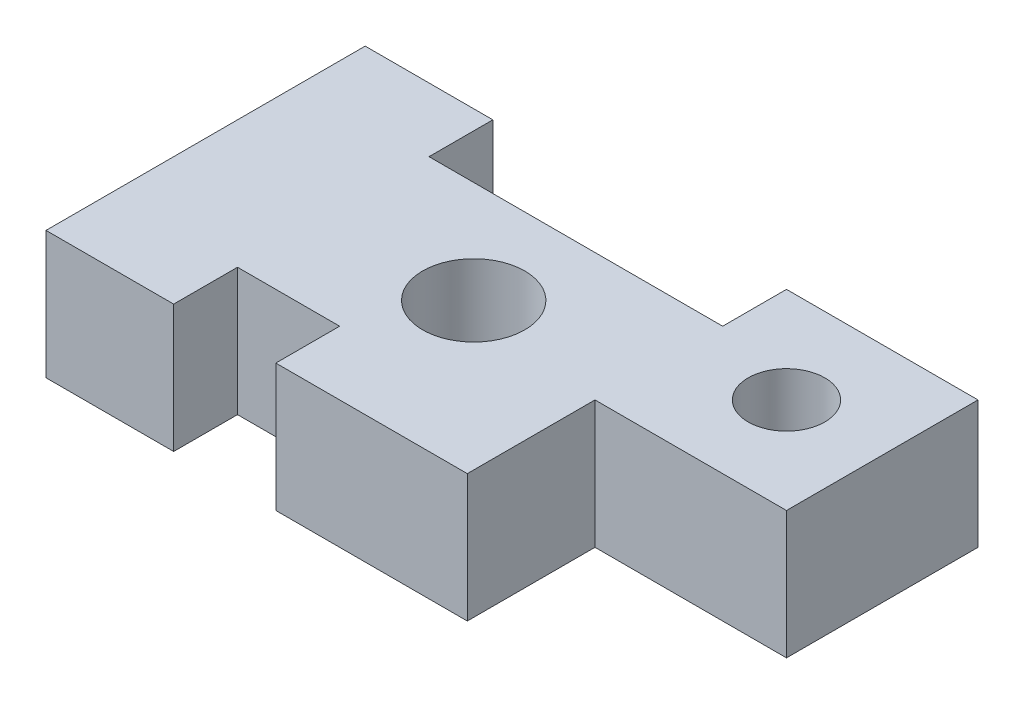
ISO-10303-21;
HEADER;
FILE_DESCRIPTION(('STEP AP214'),'2;1');
FILE_NAME('part.step','',(''),(''),'','','');
FILE_SCHEMA(('AUTOMOTIVE_DESIGN { 1 0 10303 214 1 1 1 1 }'));
ENDSEC;
DATA;
#1=APPLICATION_CONTEXT('core data for automotive mechanical design processes');
#2=APPLICATION_PROTOCOL_DEFINITION('international standard','automotive_design',2000,#1);
#3=PRODUCT_CONTEXT('',#1,'mechanical');
#4=PRODUCT('Part','Part','',(#3));
#5=PRODUCT_RELATED_PRODUCT_CATEGORY('part','',(#4));
#6=PRODUCT_DEFINITION_FORMATION('','',#4);
#7=PRODUCT_DEFINITION_CONTEXT('part definition',#1,'design');
#8=PRODUCT_DEFINITION('design','',#6,#7);
#9=PRODUCT_DEFINITION_SHAPE('','',#8);
#10=(LENGTH_UNIT() NAMED_UNIT(*) SI_UNIT(.MILLI.,.METRE.));
#11=(NAMED_UNIT(*) PLANE_ANGLE_UNIT() SI_UNIT($,.RADIAN.));
#12=(NAMED_UNIT(*) SI_UNIT($,.STERADIAN.) SOLID_ANGLE_UNIT());
#13=UNCERTAINTY_MEASURE_WITH_UNIT(LENGTH_MEASURE(1.E-05),#10,'distance_accuracy_value','');
#14=(GEOMETRIC_REPRESENTATION_CONTEXT(3) GLOBAL_UNCERTAINTY_ASSIGNED_CONTEXT((#13)) GLOBAL_UNIT_ASSIGNED_CONTEXT((#10,
#11,#12)) REPRESENTATION_CONTEXT('',''));
#15=CARTESIAN_POINT('',(0.,0.,0.));
#16=DIRECTION('',(0.,0.,1.));
#17=DIRECTION('',(1.,0.,0.));
#18=AXIS2_PLACEMENT_3D('',#15,#16,#17);
#19=CARTESIAN_POINT('',(0.,100.,0.));
#20=DIRECTION('',(0.,1.,0.));
#21=DIRECTION('',(0.,0.,1.));
#22=AXIS2_PLACEMENT_3D('',#19,#20,#21);
#23=PLANE('',#22);
#24=CARTESIAN_POINT('',(215.,100.,-120.));
#25=DIRECTION('',(0.,1.,0.));
#26=DIRECTION('',(0.,0.,1.));
#27=AXIS2_PLACEMENT_3D('',#24,#25,#26);
#28=CIRCLE('',#27,39.9999999999999);
#29=CARTESIAN_POINT('',(215.,100.,-160.));
#30=VERTEX_POINT('',#29);
#31=EDGE_CURVE('E170',#30,#30,#28,.T.);
#32=ORIENTED_EDGE('',*,*,#31,.F.);
#33=EDGE_LOOP('',(#32));
#34=FACE_BOUND('',#33,.T.);
#35=DIRECTION('',(0.,0.,1.));
#36=VECTOR('',#35,1.);
#37=CARTESIAN_POINT('',(0.,100.,0.));
#38=LINE('',#37,#36);
#39=CARTESIAN_POINT('',(0.,100.,-250.));
#40=VERTEX_POINT('',#39);
#41=CARTESIAN_POINT('',(0.,100.,0.));
#42=VERTEX_POINT('',#41);
#43=EDGE_CURVE('E193',#40,#42,#38,.T.);
#44=ORIENTED_EDGE('',*,*,#43,.T.);
#45=DIRECTION('',(1.,0.,0.));
#46=VECTOR('',#45,1.);
#47=CARTESIAN_POINT('',(0.,100.,0.));
#48=LINE('',#47,#46);
#49=CARTESIAN_POINT('',(100.,100.,0.));
#50=VERTEX_POINT('',#49);
#51=EDGE_CURVE('E111',#42,#50,#48,.T.);
#52=ORIENTED_EDGE('',*,*,#51,.T.);
#53=DIRECTION('',(0.,0.,-1.));
#54=VECTOR('',#53,1.);
#55=CARTESIAN_POINT('',(100.,100.,0.));
#56=LINE('',#55,#54);
#57=CARTESIAN_POINT('',(100.,100.,-50.));
#58=VERTEX_POINT('',#57);
#59=EDGE_CURVE('E226',#50,#58,#56,.T.);
#60=ORIENTED_EDGE('',*,*,#59,.T.);
#61=DIRECTION('',(1.,0.,0.));
#62=VECTOR('',#61,1.);
#63=CARTESIAN_POINT('',(100.,100.,-50.));
#64=LINE('',#63,#62);
#65=CARTESIAN_POINT('',(180.,100.,-50.));
#66=VERTEX_POINT('',#65);
#67=EDGE_CURVE('E245',#58,#66,#64,.T.);
#68=ORIENTED_EDGE('',*,*,#67,.T.);
#69=DIRECTION('',(0.,0.,1.));
#70=VECTOR('',#69,1.);
#71=CARTESIAN_POINT('',(180.,100.,-50.));
#72=LINE('',#71,#70);
#73=CARTESIAN_POINT('',(180.,100.,0.));
#74=VERTEX_POINT('',#73);
#75=EDGE_CURVE('E242',#66,#74,#72,.T.);
#76=ORIENTED_EDGE('',*,*,#75,.T.);
#77=DIRECTION('',(1.,0.,0.));
#78=VECTOR('',#77,1.);
#79=CARTESIAN_POINT('',(180.,100.,0.));
#80=LINE('',#79,#78);
#81=CARTESIAN_POINT('',(330.,100.,0.));
#82=VERTEX_POINT('',#81);
#83=EDGE_CURVE('E244',#74,#82,#80,.T.);
#84=ORIENTED_EDGE('',*,*,#83,.T.);
#85=DIRECTION('',(0.,0.,-1.));
#86=VECTOR('',#85,1.);
#87=CARTESIAN_POINT('',(330.,100.,0.));
#88=LINE('',#87,#86);
#89=CARTESIAN_POINT('',(330.,100.,-100.));
#90=VERTEX_POINT('',#89);
#91=EDGE_CURVE('E247',#82,#90,#88,.T.);
#92=ORIENTED_EDGE('',*,*,#91,.T.);
#93=DIRECTION('',(1.,0.,0.));
#94=VECTOR('',#93,1.);
#95=CARTESIAN_POINT('',(330.,100.,-100.));
#96=LINE('',#95,#94);
#97=CARTESIAN_POINT('',(480.,100.,-100.));
#98=VERTEX_POINT('',#97);
#99=EDGE_CURVE('E253',#90,#98,#96,.T.);
#100=ORIENTED_EDGE('',*,*,#99,.T.);
#101=DIRECTION('',(0.,0.,-1.));
#102=VECTOR('',#101,1.);
#103=CARTESIAN_POINT('',(480.,100.,-100.));
#104=LINE('',#103,#102);
#105=CARTESIAN_POINT('',(480.,100.,-250.));
#106=VERTEX_POINT('',#105);
#107=EDGE_CURVE('E255',#98,#106,#104,.T.);
#108=ORIENTED_EDGE('',*,*,#107,.T.);
#109=DIRECTION('',(-1.,0.,0.));
#110=VECTOR('',#109,1.);
#111=CARTESIAN_POINT('',(480.,100.,-250.));
#112=LINE('',#111,#110);
#113=CARTESIAN_POINT('',(330.,100.,-250.));
#114=VERTEX_POINT('',#113);
#115=EDGE_CURVE('E257',#106,#114,#112,.T.);
#116=ORIENTED_EDGE('',*,*,#115,.T.);
#117=DIRECTION('',(0.,0.,1.));
#118=VECTOR('',#117,1.);
#119=CARTESIAN_POINT('',(330.,100.,-250.));
#120=LINE('',#119,#118);
#121=CARTESIAN_POINT('',(330.,100.,-200.));
#122=VERTEX_POINT('',#121);
#123=EDGE_CURVE('E148',#114,#122,#120,.T.);
#124=ORIENTED_EDGE('',*,*,#123,.T.);
#125=DIRECTION('',(-1.,0.,0.));
#126=VECTOR('',#125,1.);
#127=CARTESIAN_POINT('',(330.,100.,-200.));
#128=LINE('',#127,#126);
#129=CARTESIAN_POINT('',(100.,100.,-200.));
#130=VERTEX_POINT('',#129);
#131=EDGE_CURVE('E142',#122,#130,#128,.T.);
#132=ORIENTED_EDGE('',*,*,#131,.T.);
#133=DIRECTION('',(0.,0.,-1.));
#134=VECTOR('',#133,1.);
#135=CARTESIAN_POINT('',(100.,100.,-200.));
#136=LINE('',#135,#134);
#137=CARTESIAN_POINT('',(100.,100.,-250.));
#138=VERTEX_POINT('',#137);
#139=EDGE_CURVE('E146',#130,#138,#136,.T.);
#140=ORIENTED_EDGE('',*,*,#139,.T.);
#141=DIRECTION('',(-1.,0.,0.));
#142=VECTOR('',#141,1.);
#143=CARTESIAN_POINT('',(100.,100.,-250.));
#144=LINE('',#143,#142);
#145=EDGE_CURVE('E50',#138,#40,#144,.T.);
#146=ORIENTED_EDGE('',*,*,#145,.T.);
#147=EDGE_LOOP('',(#44,#52,#60,#68,#76,#84,#92,#100,#108,#116,#124,#132,#140,#146));
#148=FACE_BOUND('',#147,.T.);
#149=CARTESIAN_POINT('',(405.,100.,-175.));
#150=DIRECTION('',(0.,1.,0.));
#151=DIRECTION('',(0.,0.,1.));
#152=AXIS2_PLACEMENT_3D('',#149,#150,#151);
#153=CIRCLE('',#152,30.);
#154=CARTESIAN_POINT('',(405.,100.,-205.));
#155=VERTEX_POINT('',#154);
#156=EDGE_CURVE('E300',#155,#155,#153,.T.);
#157=ORIENTED_EDGE('',*,*,#156,.F.);
#158=EDGE_LOOP('',(#157));
#159=FACE_BOUND('',#158,.T.);
#160=ADVANCED_FACE('F33',(#34,#148,#159),#23,.T.);
#161=CARTESIAN_POINT('',(0.,0.,0.));
#162=DIRECTION('',(0.,1.,0.));
#163=DIRECTION('',(0.,0.,1.));
#164=AXIS2_PLACEMENT_3D('',#161,#162,#163);
#165=PLANE('',#164);
#166=CARTESIAN_POINT('',(215.,0.,-120.));
#167=DIRECTION('',(0.,1.,0.));
#168=DIRECTION('',(0.,0.,1.));
#169=AXIS2_PLACEMENT_3D('',#166,#167,#168);
#170=CIRCLE('',#169,39.9999999999999);
#171=CARTESIAN_POINT('',(215.,0.,-160.));
#172=VERTEX_POINT('',#171);
#173=EDGE_CURVE('E305',#172,#172,#170,.T.);
#174=ORIENTED_EDGE('',*,*,#173,.T.);
#175=EDGE_LOOP('',(#174));
#176=FACE_BOUND('',#175,.T.);
#177=DIRECTION('',(0.,0.,1.));
#178=VECTOR('',#177,1.);
#179=CARTESIAN_POINT('',(0.,0.,0.));
#180=LINE('',#179,#178);
#181=CARTESIAN_POINT('',(0.,0.,-250.));
#182=VERTEX_POINT('',#181);
#183=CARTESIAN_POINT('',(0.,0.,0.));
#184=VERTEX_POINT('',#183);
#185=EDGE_CURVE('E166',#182,#184,#180,.T.);
#186=ORIENTED_EDGE('',*,*,#185,.F.);
#187=DIRECTION('',(-1.,0.,0.));
#188=VECTOR('',#187,1.);
#189=CARTESIAN_POINT('',(100.,0.,-250.));
#190=LINE('',#189,#188);
#191=CARTESIAN_POINT('',(100.,0.,-250.));
#192=VERTEX_POINT('',#191);
#193=EDGE_CURVE('E103',#192,#182,#190,.T.);
#194=ORIENTED_EDGE('',*,*,#193,.F.);
#195=DIRECTION('',(0.,0.,-1.));
#196=VECTOR('',#195,1.);
#197=CARTESIAN_POINT('',(100.,0.,-200.));
#198=LINE('',#197,#196);
#199=CARTESIAN_POINT('',(100.,0.,-200.));
#200=VERTEX_POINT('',#199);
#201=EDGE_CURVE('E97',#200,#192,#198,.T.);
#202=ORIENTED_EDGE('',*,*,#201,.F.);
#203=DIRECTION('',(-1.,0.,0.));
#204=VECTOR('',#203,1.);
#205=CARTESIAN_POINT('',(330.,0.,-200.));
#206=LINE('',#205,#204);
#207=CARTESIAN_POINT('',(330.,0.,-200.));
#208=VERTEX_POINT('',#207);
#209=EDGE_CURVE('E156',#208,#200,#206,.T.);
#210=ORIENTED_EDGE('',*,*,#209,.F.);
#211=DIRECTION('',(0.,0.,1.));
#212=VECTOR('',#211,1.);
#213=CARTESIAN_POINT('',(330.,0.,-250.));
#214=LINE('',#213,#212);
#215=CARTESIAN_POINT('',(330.,0.,-250.));
#216=VERTEX_POINT('',#215);
#217=EDGE_CURVE('E188',#216,#208,#214,.T.);
#218=ORIENTED_EDGE('',*,*,#217,.F.);
#219=DIRECTION('',(-1.,0.,0.));
#220=VECTOR('',#219,1.);
#221=CARTESIAN_POINT('',(480.,0.,-250.));
#222=LINE('',#221,#220);
#223=CARTESIAN_POINT('',(480.,0.,-250.));
#224=VERTEX_POINT('',#223);
#225=EDGE_CURVE('E186',#224,#216,#222,.T.);
#226=ORIENTED_EDGE('',*,*,#225,.F.);
#227=DIRECTION('',(0.,0.,-1.));
#228=VECTOR('',#227,1.);
#229=CARTESIAN_POINT('',(480.,0.,-100.));
#230=LINE('',#229,#228);
#231=CARTESIAN_POINT('',(480.,0.,-100.));
#232=VERTEX_POINT('',#231);
#233=EDGE_CURVE('E184',#232,#224,#230,.T.);
#234=ORIENTED_EDGE('',*,*,#233,.F.);
#235=DIRECTION('',(1.,0.,0.));
#236=VECTOR('',#235,1.);
#237=CARTESIAN_POINT('',(330.,0.,-100.));
#238=LINE('',#237,#236);
#239=CARTESIAN_POINT('',(330.,0.,-100.));
#240=VERTEX_POINT('',#239);
#241=EDGE_CURVE('E182',#240,#232,#238,.T.);
#242=ORIENTED_EDGE('',*,*,#241,.F.);
#243=DIRECTION('',(0.,0.,-1.));
#244=VECTOR('',#243,1.);
#245=CARTESIAN_POINT('',(330.,0.,0.));
#246=LINE('',#245,#244);
#247=CARTESIAN_POINT('',(330.,0.,0.));
#248=VERTEX_POINT('',#247);
#249=EDGE_CURVE('E180',#248,#240,#246,.T.);
#250=ORIENTED_EDGE('',*,*,#249,.F.);
#251=DIRECTION('',(1.,0.,0.));
#252=VECTOR('',#251,1.);
#253=CARTESIAN_POINT('',(180.,0.,0.));
#254=LINE('',#253,#252);
#255=CARTESIAN_POINT('',(180.,0.,0.));
#256=VERTEX_POINT('',#255);
#257=EDGE_CURVE('E178',#256,#248,#254,.T.);
#258=ORIENTED_EDGE('',*,*,#257,.F.);
#259=DIRECTION('',(0.,0.,1.));
#260=VECTOR('',#259,1.);
#261=CARTESIAN_POINT('',(180.,0.,-50.));
#262=LINE('',#261,#260);
#263=CARTESIAN_POINT('',(180.,0.,-50.));
#264=VERTEX_POINT('',#263);
#265=EDGE_CURVE('E176',#264,#256,#262,.T.);
#266=ORIENTED_EDGE('',*,*,#265,.F.);
#267=DIRECTION('',(1.,0.,0.));
#268=VECTOR('',#267,1.);
#269=CARTESIAN_POINT('',(100.,0.,-50.));
#270=LINE('',#269,#268);
#271=CARTESIAN_POINT('',(100.,0.,-50.));
#272=VERTEX_POINT('',#271);
#273=EDGE_CURVE('E174',#272,#264,#270,.T.);
#274=ORIENTED_EDGE('',*,*,#273,.F.);
#275=DIRECTION('',(0.,0.,-1.));
#276=VECTOR('',#275,1.);
#277=CARTESIAN_POINT('',(100.,0.,0.));
#278=LINE('',#277,#276);
#279=CARTESIAN_POINT('',(100.,0.,0.));
#280=VERTEX_POINT('',#279);
#281=EDGE_CURVE('E172',#280,#272,#278,.T.);
#282=ORIENTED_EDGE('',*,*,#281,.F.);
#283=DIRECTION('',(1.,0.,0.));
#284=VECTOR('',#283,1.);
#285=CARTESIAN_POINT('',(0.,0.,0.));
#286=LINE('',#285,#284);
#287=EDGE_CURVE('E169',#184,#280,#286,.T.);
#288=ORIENTED_EDGE('',*,*,#287,.F.);
#289=EDGE_LOOP('',(#186,#194,#202,#210,#218,#226,#234,#242,#250,#258,#266,#274,#282,#288));
#290=FACE_BOUND('',#289,.T.);
#291=CARTESIAN_POINT('',(405.,0.,-175.));
#292=DIRECTION('',(0.,1.,0.));
#293=DIRECTION('',(0.,0.,1.));
#294=AXIS2_PLACEMENT_3D('',#291,#292,#293);
#295=CIRCLE('',#294,30.);
#296=CARTESIAN_POINT('',(405.,0.,-205.));
#297=VERTEX_POINT('',#296);
#298=EDGE_CURVE('E303',#297,#297,#295,.T.);
#299=ORIENTED_EDGE('',*,*,#298,.T.);
#300=EDGE_LOOP('',(#299));
#301=FACE_BOUND('',#300,.T.);
#302=ADVANCED_FACE('F230',(#176,#290,#301),#165,.F.);
#303=CARTESIAN_POINT('',(0.,100.,0.));
#304=DIRECTION('',(1.,0.,0.));
#305=DIRECTION('',(0.,0.,-1.));
#306=AXIS2_PLACEMENT_3D('',#303,#304,#305);
#307=PLANE('',#306);
#308=ORIENTED_EDGE('',*,*,#185,.T.);
#309=DIRECTION('',(0.,-1.,0.));
#310=VECTOR('',#309,1.);
#311=CARTESIAN_POINT('',(0.,100.,0.));
#312=LINE('',#311,#310);
#313=EDGE_CURVE('E11',#42,#184,#312,.T.);
#314=ORIENTED_EDGE('',*,*,#313,.F.);
#315=ORIENTED_EDGE('',*,*,#43,.F.);
#316=DIRECTION('',(0.,-1.,0.));
#317=VECTOR('',#316,1.);
#318=CARTESIAN_POINT('',(0.,100.,-250.));
#319=LINE('',#318,#317);
#320=EDGE_CURVE('E162',#40,#182,#319,.T.);
#321=ORIENTED_EDGE('',*,*,#320,.T.);
#322=EDGE_LOOP('',(#308,#314,#315,#321));
#323=FACE_BOUND('',#322,.T.);
#324=ADVANCED_FACE('F35',(#323),#307,.F.);
#325=CARTESIAN_POINT('',(0.,100.,0.));
#326=DIRECTION('',(0.,0.,-1.));
#327=DIRECTION('',(-1.,0.,0.));
#328=AXIS2_PLACEMENT_3D('',#325,#326,#327);
#329=PLANE('',#328);
#330=ORIENTED_EDGE('',*,*,#287,.T.);
#331=DIRECTION('',(0.,-1.,0.));
#332=VECTOR('',#331,1.);
#333=CARTESIAN_POINT('',(100.,100.,0.));
#334=LINE('',#333,#332);
#335=EDGE_CURVE('E42',#50,#280,#334,.T.);
#336=ORIENTED_EDGE('',*,*,#335,.F.);
#337=ORIENTED_EDGE('',*,*,#51,.F.);
#338=ORIENTED_EDGE('',*,*,#313,.T.);
#339=EDGE_LOOP('',(#330,#336,#337,#338));
#340=FACE_BOUND('',#339,.T.);
#341=ADVANCED_FACE('F418',(#340),#329,.F.);
#342=CARTESIAN_POINT('',(100.,100.,0.));
#343=DIRECTION('',(-1.,0.,0.));
#344=DIRECTION('',(0.,0.,1.));
#345=AXIS2_PLACEMENT_3D('',#342,#343,#344);
#346=PLANE('',#345);
#347=ORIENTED_EDGE('',*,*,#281,.T.);
#348=DIRECTION('',(0.,-1.,0.));
#349=VECTOR('',#348,1.);
#350=CARTESIAN_POINT('',(100.,100.,-50.));
#351=LINE('',#350,#349);
#352=EDGE_CURVE('E218',#58,#272,#351,.T.);
#353=ORIENTED_EDGE('',*,*,#352,.F.);
#354=ORIENTED_EDGE('',*,*,#59,.F.);
#355=ORIENTED_EDGE('',*,*,#335,.T.);
#356=EDGE_LOOP('',(#347,#353,#354,#355));
#357=FACE_BOUND('',#356,.T.);
#358=ADVANCED_FACE('F224',(#357),#346,.F.);
#359=CARTESIAN_POINT('',(100.,100.,-50.));
#360=DIRECTION('',(0.,0.,-1.));
#361=DIRECTION('',(-1.,0.,0.));
#362=AXIS2_PLACEMENT_3D('',#359,#360,#361);
#363=PLANE('',#362);
#364=ORIENTED_EDGE('',*,*,#273,.T.);
#365=DIRECTION('',(0.,-1.,0.));
#366=VECTOR('',#365,1.);
#367=CARTESIAN_POINT('',(180.,100.,-50.));
#368=LINE('',#367,#366);
#369=EDGE_CURVE('E215',#66,#264,#368,.T.);
#370=ORIENTED_EDGE('',*,*,#369,.F.);
#371=ORIENTED_EDGE('',*,*,#67,.F.);
#372=ORIENTED_EDGE('',*,*,#352,.T.);
#373=EDGE_LOOP('',(#364,#370,#371,#372));
#374=FACE_BOUND('',#373,.T.);
#375=ADVANCED_FACE('F236',(#374),#363,.F.);
#376=CARTESIAN_POINT('',(180.,100.,-50.));
#377=DIRECTION('',(1.,0.,0.));
#378=DIRECTION('',(0.,0.,-1.));
#379=AXIS2_PLACEMENT_3D('',#376,#377,#378);
#380=PLANE('',#379);
#381=ORIENTED_EDGE('',*,*,#265,.T.);
#382=DIRECTION('',(0.,-1.,0.));
#383=VECTOR('',#382,1.);
#384=CARTESIAN_POINT('',(180.,100.,0.));
#385=LINE('',#384,#383);
#386=EDGE_CURVE('E212',#74,#256,#385,.T.);
#387=ORIENTED_EDGE('',*,*,#386,.F.);
#388=ORIENTED_EDGE('',*,*,#75,.F.);
#389=ORIENTED_EDGE('',*,*,#369,.T.);
#390=EDGE_LOOP('',(#381,#387,#388,#389));
#391=FACE_BOUND('',#390,.T.);
#392=ADVANCED_FACE('F240',(#391),#380,.F.);
#393=CARTESIAN_POINT('',(180.,100.,0.));
#394=DIRECTION('',(0.,0.,-1.));
#395=DIRECTION('',(-1.,0.,0.));
#396=AXIS2_PLACEMENT_3D('',#393,#394,#395);
#397=PLANE('',#396);
#398=ORIENTED_EDGE('',*,*,#257,.T.);
#399=DIRECTION('',(0.,-1.,0.));
#400=VECTOR('',#399,1.);
#401=CARTESIAN_POINT('',(330.,100.,0.));
#402=LINE('',#401,#400);
#403=EDGE_CURVE('E209',#82,#248,#402,.T.);
#404=ORIENTED_EDGE('',*,*,#403,.F.);
#405=ORIENTED_EDGE('',*,*,#83,.F.);
#406=ORIENTED_EDGE('',*,*,#386,.T.);
#407=EDGE_LOOP('',(#398,#404,#405,#406));
#408=FACE_BOUND('',#407,.T.);
#409=ADVANCED_FACE('F383',(#408),#397,.F.);
#410=CARTESIAN_POINT('',(330.,100.,0.));
#411=DIRECTION('',(-1.,0.,0.));
#412=DIRECTION('',(0.,0.,1.));
#413=AXIS2_PLACEMENT_3D('',#410,#411,#412);
#414=PLANE('',#413);
#415=ORIENTED_EDGE('',*,*,#249,.T.);
#416=DIRECTION('',(0.,-1.,0.));
#417=VECTOR('',#416,1.);
#418=CARTESIAN_POINT('',(330.,100.,-100.));
#419=LINE('',#418,#417);
#420=EDGE_CURVE('E206',#90,#240,#419,.T.);
#421=ORIENTED_EDGE('',*,*,#420,.F.);
#422=ORIENTED_EDGE('',*,*,#91,.F.);
#423=ORIENTED_EDGE('',*,*,#403,.T.);
#424=EDGE_LOOP('',(#415,#421,#422,#423));
#425=FACE_BOUND('',#424,.T.);
#426=ADVANCED_FACE('F373',(#425),#414,.F.);
#427=CARTESIAN_POINT('',(330.,100.,-100.));
#428=DIRECTION('',(0.,0.,-1.));
#429=DIRECTION('',(-1.,0.,0.));
#430=AXIS2_PLACEMENT_3D('',#427,#428,#429);
#431=PLANE('',#430);
#432=ORIENTED_EDGE('',*,*,#241,.T.);
#433=DIRECTION('',(0.,-1.,0.));
#434=VECTOR('',#433,1.);
#435=CARTESIAN_POINT('',(480.,100.,-100.));
#436=LINE('',#435,#434);
#437=EDGE_CURVE('E203',#98,#232,#436,.T.);
#438=ORIENTED_EDGE('',*,*,#437,.F.);
#439=ORIENTED_EDGE('',*,*,#99,.F.);
#440=ORIENTED_EDGE('',*,*,#420,.T.);
#441=EDGE_LOOP('',(#432,#438,#439,#440));
#442=FACE_BOUND('',#441,.T.);
#443=ADVANCED_FACE('F363',(#442),#431,.F.);
#444=CARTESIAN_POINT('',(480.,100.,-100.));
#445=DIRECTION('',(-1.,0.,0.));
#446=DIRECTION('',(0.,0.,1.));
#447=AXIS2_PLACEMENT_3D('',#444,#445,#446);
#448=PLANE('',#447);
#449=ORIENTED_EDGE('',*,*,#233,.T.);
#450=DIRECTION('',(0.,-1.,0.));
#451=VECTOR('',#450,1.);
#452=CARTESIAN_POINT('',(480.,100.,-250.));
#453=LINE('',#452,#451);
#454=EDGE_CURVE('E200',#106,#224,#453,.T.);
#455=ORIENTED_EDGE('',*,*,#454,.F.);
#456=ORIENTED_EDGE('',*,*,#107,.F.);
#457=ORIENTED_EDGE('',*,*,#437,.T.);
#458=EDGE_LOOP('',(#449,#455,#456,#457));
#459=FACE_BOUND('',#458,.T.);
#460=ADVANCED_FACE('F354',(#459),#448,.F.);
#461=CARTESIAN_POINT('',(480.,100.,-250.));
#462=DIRECTION('',(0.,0.,1.));
#463=DIRECTION('',(1.,0.,0.));
#464=AXIS2_PLACEMENT_3D('',#461,#462,#463);
#465=PLANE('',#464);
#466=ORIENTED_EDGE('',*,*,#225,.T.);
#467=DIRECTION('',(0.,-1.,0.));
#468=VECTOR('',#467,1.);
#469=CARTESIAN_POINT('',(330.,100.,-250.));
#470=LINE('',#469,#468);
#471=EDGE_CURVE('E197',#114,#216,#470,.T.);
#472=ORIENTED_EDGE('',*,*,#471,.F.);
#473=ORIENTED_EDGE('',*,*,#115,.F.);
#474=ORIENTED_EDGE('',*,*,#454,.T.);
#475=EDGE_LOOP('',(#466,#472,#473,#474));
#476=FACE_BOUND('',#475,.T.);
#477=ADVANCED_FACE('F263',(#476),#465,.F.);
#478=CARTESIAN_POINT('',(330.,100.,-250.));
#479=DIRECTION('',(1.,0.,0.));
#480=DIRECTION('',(0.,0.,-1.));
#481=AXIS2_PLACEMENT_3D('',#478,#479,#480);
#482=PLANE('',#481);
#483=ORIENTED_EDGE('',*,*,#217,.T.);
#484=DIRECTION('',(0.,-1.,0.));
#485=VECTOR('',#484,1.);
#486=CARTESIAN_POINT('',(330.,100.,-200.));
#487=LINE('',#486,#485);
#488=EDGE_CURVE('E157',#122,#208,#487,.T.);
#489=ORIENTED_EDGE('',*,*,#488,.F.);
#490=ORIENTED_EDGE('',*,*,#123,.F.);
#491=ORIENTED_EDGE('',*,*,#471,.T.);
#492=EDGE_LOOP('',(#483,#489,#490,#491));
#493=FACE_BOUND('',#492,.T.);
#494=ADVANCED_FACE('F267',(#493),#482,.F.);
#495=CARTESIAN_POINT('',(330.,100.,-200.));
#496=DIRECTION('',(0.,0.,1.));
#497=DIRECTION('',(1.,0.,0.));
#498=AXIS2_PLACEMENT_3D('',#495,#496,#497);
#499=PLANE('',#498);
#500=ORIENTED_EDGE('',*,*,#209,.T.);
#501=DIRECTION('',(0.,-1.,0.));
#502=VECTOR('',#501,1.);
#503=CARTESIAN_POINT('',(100.,100.,-200.));
#504=LINE('',#503,#502);
#505=EDGE_CURVE('E153',#130,#200,#504,.T.);
#506=ORIENTED_EDGE('',*,*,#505,.F.);
#507=ORIENTED_EDGE('',*,*,#131,.F.);
#508=ORIENTED_EDGE('',*,*,#488,.T.);
#509=EDGE_LOOP('',(#500,#506,#507,#508));
#510=FACE_BOUND('',#509,.T.);
#511=ADVANCED_FACE('F154',(#510),#499,.F.);
#512=CARTESIAN_POINT('',(100.,100.,-200.));
#513=DIRECTION('',(-1.,0.,0.));
#514=DIRECTION('',(0.,0.,1.));
#515=AXIS2_PLACEMENT_3D('',#512,#513,#514);
#516=PLANE('',#515);
#517=ORIENTED_EDGE('',*,*,#201,.T.);
#518=DIRECTION('',(0.,-1.,0.));
#519=VECTOR('',#518,1.);
#520=CARTESIAN_POINT('',(100.,100.,-250.));
#521=LINE('',#520,#519);
#522=EDGE_CURVE('E158',#138,#192,#521,.T.);
#523=ORIENTED_EDGE('',*,*,#522,.F.);
#524=ORIENTED_EDGE('',*,*,#139,.F.);
#525=ORIENTED_EDGE('',*,*,#505,.T.);
#526=EDGE_LOOP('',(#517,#523,#524,#525));
#527=FACE_BOUND('',#526,.T.);
#528=ADVANCED_FACE('F160',(#527),#516,.F.);
#529=CARTESIAN_POINT('',(100.,100.,-250.));
#530=DIRECTION('',(0.,0.,1.));
#531=DIRECTION('',(1.,0.,0.));
#532=AXIS2_PLACEMENT_3D('',#529,#530,#531);
#533=PLANE('',#532);
#534=ORIENTED_EDGE('',*,*,#193,.T.);
#535=ORIENTED_EDGE('',*,*,#320,.F.);
#536=ORIENTED_EDGE('',*,*,#145,.F.);
#537=ORIENTED_EDGE('',*,*,#522,.T.);
#538=EDGE_LOOP('',(#534,#535,#536,#537));
#539=FACE_BOUND('',#538,.T.);
#540=ADVANCED_FACE('F271',(#539),#533,.F.);
#541=CARTESIAN_POINT('',(215.,100.,-120.));
#542=DIRECTION('',(0.,-1.,0.));
#543=DIRECTION('',(0.,0.,-1.));
#544=AXIS2_PLACEMENT_3D('',#541,#542,#543);
#545=CYLINDRICAL_SURFACE('',#544,39.9999999999999);
#546=CARTESIAN_POINT('',(215.,100.,-160.));
#547=CARTESIAN_POINT('',(215.,98.9583333333333,-160.));
#548=CARTESIAN_POINT('',(215.,97.9166666666667,-160.));
#549=CARTESIAN_POINT('',(215.,95.8333333333333,-160.));
#550=CARTESIAN_POINT('',(215.,94.7916666666666,-160.));
#551=CARTESIAN_POINT('',(215.,92.7083333333333,-160.));
#552=CARTESIAN_POINT('',(215.,91.6666666666666,-160.));
#553=CARTESIAN_POINT('',(215.,89.5833333333333,-160.));
#554=CARTESIAN_POINT('',(215.,88.5416666666667,-160.));
#555=CARTESIAN_POINT('',(215.,86.4583333333333,-160.));
#556=CARTESIAN_POINT('',(215.,85.4166666666667,-160.));
#557=CARTESIAN_POINT('',(215.,83.3333333333333,-160.));
#558=CARTESIAN_POINT('',(215.,82.2916666666667,-160.));
#559=CARTESIAN_POINT('',(215.,80.2083333333333,-160.));
#560=CARTESIAN_POINT('',(215.,79.1666666666666,-160.));
#561=CARTESIAN_POINT('',(215.,77.0833333333333,-160.));
#562=CARTESIAN_POINT('',(215.,76.0416666666666,-160.));
#563=CARTESIAN_POINT('',(215.,73.9583333333333,-160.));
#564=CARTESIAN_POINT('',(215.,72.9166666666667,-160.));
#565=CARTESIAN_POINT('',(215.,70.8333333333333,-160.));
#566=CARTESIAN_POINT('',(215.,69.7916666666667,-160.));
#567=CARTESIAN_POINT('',(215.,67.7083333333333,-160.));
#568=CARTESIAN_POINT('',(215.,66.6666666666667,-160.));
#569=CARTESIAN_POINT('',(215.,64.5833333333333,-160.));
#570=CARTESIAN_POINT('',(215.,63.5416666666667,-160.));
#571=CARTESIAN_POINT('',(215.,61.4583333333333,-160.));
#572=CARTESIAN_POINT('',(215.,60.4166666666667,-160.));
#573=CARTESIAN_POINT('',(215.,58.3333333333333,-160.));
#574=CARTESIAN_POINT('',(215.,57.2916666666667,-160.));
#575=CARTESIAN_POINT('',(215.,55.2083333333333,-160.));
#576=CARTESIAN_POINT('',(215.,54.1666666666667,-160.));
#577=CARTESIAN_POINT('',(215.,52.0833333333333,-160.));
#578=CARTESIAN_POINT('',(215.,51.0416666666667,-160.));
#579=CARTESIAN_POINT('',(215.,48.9583333333333,-160.));
#580=CARTESIAN_POINT('',(215.,47.9166666666667,-160.));
#581=CARTESIAN_POINT('',(215.,45.8333333333333,-160.));
#582=CARTESIAN_POINT('',(215.,44.7916666666667,-160.));
#583=CARTESIAN_POINT('',(215.,42.7083333333333,-160.));
#584=CARTESIAN_POINT('',(215.,41.6666666666667,-160.));
#585=CARTESIAN_POINT('',(215.,39.5833333333333,-160.));
#586=CARTESIAN_POINT('',(215.,38.5416666666667,-160.));
#587=CARTESIAN_POINT('',(215.,36.4583333333333,-160.));
#588=CARTESIAN_POINT('',(215.,35.4166666666667,-160.));
#589=CARTESIAN_POINT('',(215.,33.3333333333333,-160.));
#590=CARTESIAN_POINT('',(215.,32.2916666666667,-160.));
#591=CARTESIAN_POINT('',(215.,30.2083333333333,-160.));
#592=CARTESIAN_POINT('',(215.,29.1666666666667,-160.));
#593=CARTESIAN_POINT('',(215.,27.0833333333333,-160.));
#594=CARTESIAN_POINT('',(215.,26.0416666666667,-160.));
#595=CARTESIAN_POINT('',(215.,23.9583333333333,-160.));
#596=CARTESIAN_POINT('',(215.,22.9166666666667,-160.));
#597=CARTESIAN_POINT('',(215.,20.8333333333333,-160.));
#598=CARTESIAN_POINT('',(215.,19.7916666666667,-160.));
#599=CARTESIAN_POINT('',(215.,17.7083333333333,-160.));
#600=CARTESIAN_POINT('',(215.,16.6666666666667,-160.));
#601=CARTESIAN_POINT('',(215.,14.5833333333333,-160.));
#602=CARTESIAN_POINT('',(215.,13.5416666666667,-160.));
#603=CARTESIAN_POINT('',(215.,11.4583333333333,-160.));
#604=CARTESIAN_POINT('',(215.,10.4166666666667,-160.));
#605=CARTESIAN_POINT('',(215.,8.33333333333333,-160.));
#606=CARTESIAN_POINT('',(215.,7.29166666666667,-160.));
#607=CARTESIAN_POINT('',(215.,5.20833333333334,-160.));
#608=CARTESIAN_POINT('',(215.,4.16666666666667,-160.));
#609=CARTESIAN_POINT('',(215.,2.08333333333334,-160.));
#610=CARTESIAN_POINT('',(215.,1.04166666666667,-160.));
#611=CARTESIAN_POINT('',(215.,0.,-160.));
#612=B_SPLINE_CURVE_WITH_KNOTS('',3,(#546,#547,#548,#549,#550,#551,#552,#553,#554,#555,#556,
#557,#558,#559,#560,#561,#562,#563,#564,#565,#566,#567,#568,#569,#570,#571,#572,#573,#574,#575,
#576,#577,#578,#579,#580,#581,#582,#583,#584,#585,#586,#587,#588,#589,#590,#591,#592,#593,#594,
#595,#596,#597,#598,#599,#600,#601,#602,#603,#604,#605,#606,#607,#608,#609,#610,#611),
.UNSPECIFIED.,.F.,.F.,(4,2,2,2,2,2,2,2,2,2,2,2,2,2,2,2,2,2,2,2,2,2,2,2,2,2,2,2,2,2,2,2,4),(0.,
3.12499999999999,6.24999999999999,9.37499999999999,12.5,15.625,18.75,21.875,25.,28.125,31.25,
34.375,37.5,40.625,43.75,46.875,50.,53.125,56.25,59.375,62.5,65.625,68.75,71.875,75.,78.125,
81.25,84.375,87.5,90.625,93.75,96.875,100.),.UNSPECIFIED.);
#613=EDGE_CURVE('BSEAM273',#30,#172,#612,.T.);
#614=ORIENTED_EDGE('',*,*,#31,.T.);
#615=ORIENTED_EDGE('',*,*,#173,.F.);
#616=ORIENTED_EDGE('',*,*,#613,.T.);
#617=ORIENTED_EDGE('',*,*,#613,.F.);
#618=EDGE_LOOP('',(#614,#616,#615,#617));
#619=FACE_BOUND('',#618,.T.);
#620=ADVANCED_FACE('F273',(#619),#545,.F.);
#621=CARTESIAN_POINT('',(405.,100.,-175.));
#622=DIRECTION('',(0.,-1.,0.));
#623=DIRECTION('',(0.,0.,-1.));
#624=AXIS2_PLACEMENT_3D('',#621,#622,#623);
#625=CYLINDRICAL_SURFACE('',#624,30.);
#626=CARTESIAN_POINT('',(405.,100.,-205.));
#627=CARTESIAN_POINT('',(405.,98.9583333333333,-205.));
#628=CARTESIAN_POINT('',(405.,97.9166666666667,-205.));
#629=CARTESIAN_POINT('',(405.,95.8333333333333,-205.));
#630=CARTESIAN_POINT('',(405.,94.7916666666666,-205.));
#631=CARTESIAN_POINT('',(405.,92.7083333333333,-205.));
#632=CARTESIAN_POINT('',(405.,91.6666666666666,-205.));
#633=CARTESIAN_POINT('',(405.,89.5833333333333,-205.));
#634=CARTESIAN_POINT('',(405.,88.5416666666667,-205.));
#635=CARTESIAN_POINT('',(405.,86.4583333333333,-205.));
#636=CARTESIAN_POINT('',(405.,85.4166666666667,-205.));
#637=CARTESIAN_POINT('',(405.,83.3333333333333,-205.));
#638=CARTESIAN_POINT('',(405.,82.2916666666667,-205.));
#639=CARTESIAN_POINT('',(405.,80.2083333333333,-205.));
#640=CARTESIAN_POINT('',(405.,79.1666666666666,-205.));
#641=CARTESIAN_POINT('',(405.,77.0833333333333,-205.));
#642=CARTESIAN_POINT('',(405.,76.0416666666666,-205.));
#643=CARTESIAN_POINT('',(405.,73.9583333333333,-205.));
#644=CARTESIAN_POINT('',(405.,72.9166666666667,-205.));
#645=CARTESIAN_POINT('',(405.,70.8333333333333,-205.));
#646=CARTESIAN_POINT('',(405.,69.7916666666667,-205.));
#647=CARTESIAN_POINT('',(405.,67.7083333333333,-205.));
#648=CARTESIAN_POINT('',(405.,66.6666666666667,-205.));
#649=CARTESIAN_POINT('',(405.,64.5833333333333,-205.));
#650=CARTESIAN_POINT('',(405.,63.5416666666667,-205.));
#651=CARTESIAN_POINT('',(405.,61.4583333333333,-205.));
#652=CARTESIAN_POINT('',(405.,60.4166666666667,-205.));
#653=CARTESIAN_POINT('',(405.,58.3333333333333,-205.));
#654=CARTESIAN_POINT('',(405.,57.2916666666667,-205.));
#655=CARTESIAN_POINT('',(405.,55.2083333333333,-205.));
#656=CARTESIAN_POINT('',(405.,54.1666666666667,-205.));
#657=CARTESIAN_POINT('',(405.,52.0833333333333,-205.));
#658=CARTESIAN_POINT('',(405.,51.0416666666667,-205.));
#659=CARTESIAN_POINT('',(405.,48.9583333333333,-205.));
#660=CARTESIAN_POINT('',(405.,47.9166666666667,-205.));
#661=CARTESIAN_POINT('',(405.,45.8333333333333,-205.));
#662=CARTESIAN_POINT('',(405.,44.7916666666667,-205.));
#663=CARTESIAN_POINT('',(405.,42.7083333333333,-205.));
#664=CARTESIAN_POINT('',(405.,41.6666666666667,-205.));
#665=CARTESIAN_POINT('',(405.,39.5833333333333,-205.));
#666=CARTESIAN_POINT('',(405.,38.5416666666667,-205.));
#667=CARTESIAN_POINT('',(405.,36.4583333333333,-205.));
#668=CARTESIAN_POINT('',(405.,35.4166666666667,-205.));
#669=CARTESIAN_POINT('',(405.,33.3333333333333,-205.));
#670=CARTESIAN_POINT('',(405.,32.2916666666667,-205.));
#671=CARTESIAN_POINT('',(405.,30.2083333333333,-205.));
#672=CARTESIAN_POINT('',(405.,29.1666666666667,-205.));
#673=CARTESIAN_POINT('',(405.,27.0833333333333,-205.));
#674=CARTESIAN_POINT('',(405.,26.0416666666667,-205.));
#675=CARTESIAN_POINT('',(405.,23.9583333333333,-205.));
#676=CARTESIAN_POINT('',(405.,22.9166666666667,-205.));
#677=CARTESIAN_POINT('',(405.,20.8333333333333,-205.));
#678=CARTESIAN_POINT('',(405.,19.7916666666667,-205.));
#679=CARTESIAN_POINT('',(405.,17.7083333333333,-205.));
#680=CARTESIAN_POINT('',(405.,16.6666666666667,-205.));
#681=CARTESIAN_POINT('',(405.,14.5833333333333,-205.));
#682=CARTESIAN_POINT('',(405.,13.5416666666667,-205.));
#683=CARTESIAN_POINT('',(405.,11.4583333333333,-205.));
#684=CARTESIAN_POINT('',(405.,10.4166666666667,-205.));
#685=CARTESIAN_POINT('',(405.,8.33333333333333,-205.));
#686=CARTESIAN_POINT('',(405.,7.29166666666667,-205.));
#687=CARTESIAN_POINT('',(405.,5.20833333333334,-205.));
#688=CARTESIAN_POINT('',(405.,4.16666666666667,-205.));
#689=CARTESIAN_POINT('',(405.,2.08333333333334,-205.));
#690=CARTESIAN_POINT('',(405.,1.04166666666667,-205.));
#691=CARTESIAN_POINT('',(405.,0.,-205.));
#692=B_SPLINE_CURVE_WITH_KNOTS('',3,(#626,#627,#628,#629,#630,#631,#632,#633,#634,#635,#636,
#637,#638,#639,#640,#641,#642,#643,#644,#645,#646,#647,#648,#649,#650,#651,#652,#653,#654,#655,
#656,#657,#658,#659,#660,#661,#662,#663,#664,#665,#666,#667,#668,#669,#670,#671,#672,#673,#674,
#675,#676,#677,#678,#679,#680,#681,#682,#683,#684,#685,#686,#687,#688,#689,#690,#691),
.UNSPECIFIED.,.F.,.F.,(4,2,2,2,2,2,2,2,2,2,2,2,2,2,2,2,2,2,2,2,2,2,2,2,2,2,2,2,2,2,2,2,4),(0.,
3.12499999999999,6.24999999999999,9.37499999999999,12.5,15.625,18.75,21.875,25.,28.125,31.25,
34.375,37.5,40.625,43.75,46.875,50.,53.125,56.25,59.375,62.5,65.625,68.75,71.875,75.,78.125,
81.25,84.375,87.5,90.625,93.75,96.875,100.),.UNSPECIFIED.);
#693=EDGE_CURVE('BSEAM279',#155,#297,#692,.T.);
#694=ORIENTED_EDGE('',*,*,#156,.T.);
#695=ORIENTED_EDGE('',*,*,#298,.F.);
#696=ORIENTED_EDGE('',*,*,#693,.T.);
#697=ORIENTED_EDGE('',*,*,#693,.F.);
#698=EDGE_LOOP('',(#694,#696,#695,#697));
#699=FACE_BOUND('',#698,.T.);
#700=ADVANCED_FACE('F279',(#699),#625,.F.);
#701=CLOSED_SHELL('',(#160,#302,#324,#341,#358,#375,#392,#409,#426,#443,#460,#477,#494,#511,
#528,#540,#620,#700));
#702=MANIFOLD_SOLID_BREP('B2',#701);
#703=ADVANCED_BREP_SHAPE_REPRESENTATION('',(#18,#702),#14);
#704=SHAPE_DEFINITION_REPRESENTATION(#9,#703);
ENDSEC;
END-ISO-10303-21;
